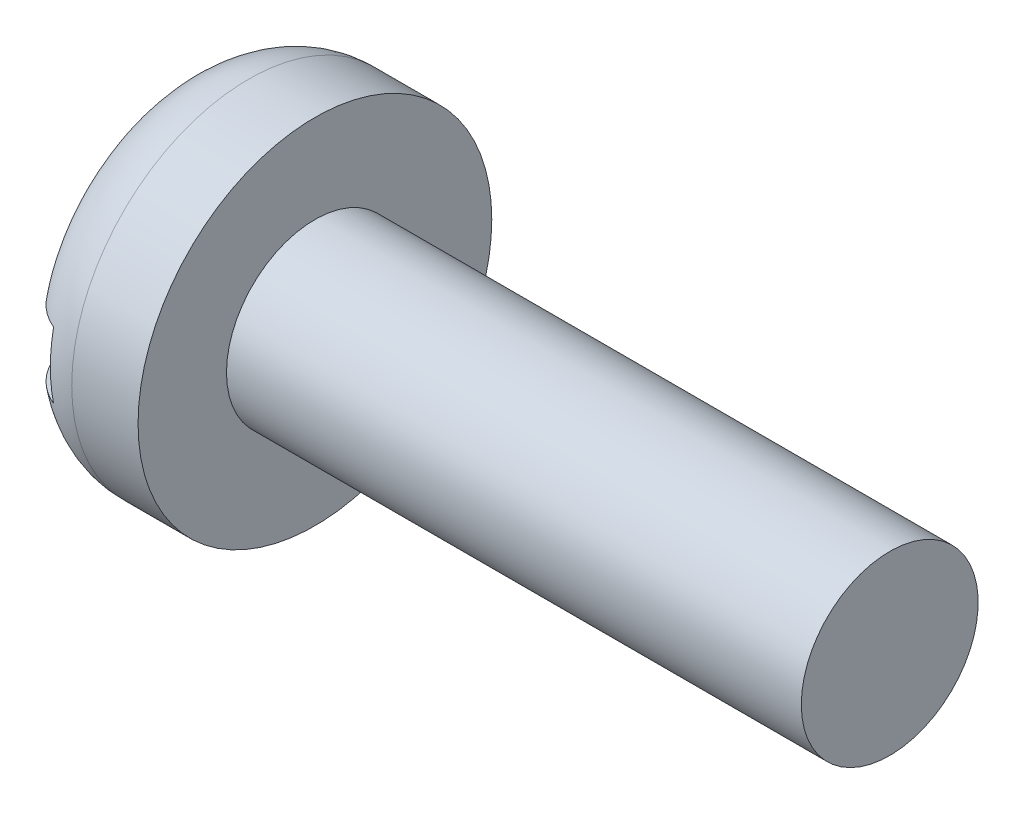
ISO-10303-21;
HEADER;
FILE_DESCRIPTION(('STEP AP214'),'2;1');
FILE_NAME('part.step','',(''),(''),'','','');
FILE_SCHEMA(('AUTOMOTIVE_DESIGN { 1 0 10303 214 1 1 1 1 }'));
ENDSEC;
DATA;
#1=APPLICATION_CONTEXT('core data for automotive mechanical design processes');
#2=APPLICATION_PROTOCOL_DEFINITION('international standard','automotive_design',2000,#1);
#3=PRODUCT_CONTEXT('',#1,'mechanical');
#4=PRODUCT('Part','Part','',(#3));
#5=PRODUCT_RELATED_PRODUCT_CATEGORY('part','',(#4));
#6=PRODUCT_DEFINITION_FORMATION('','',#4);
#7=PRODUCT_DEFINITION_CONTEXT('part definition',#1,'design');
#8=PRODUCT_DEFINITION('design','',#6,#7);
#9=PRODUCT_DEFINITION_SHAPE('','',#8);
#10=(LENGTH_UNIT() NAMED_UNIT(*) SI_UNIT(.MILLI.,.METRE.));
#11=(NAMED_UNIT(*) PLANE_ANGLE_UNIT() SI_UNIT($,.RADIAN.));
#12=(NAMED_UNIT(*) SI_UNIT($,.STERADIAN.) SOLID_ANGLE_UNIT());
#13=UNCERTAINTY_MEASURE_WITH_UNIT(LENGTH_MEASURE(1.E-05),#10,'distance_accuracy_value','');
#14=(GEOMETRIC_REPRESENTATION_CONTEXT(3) GLOBAL_UNCERTAINTY_ASSIGNED_CONTEXT((#13)) GLOBAL_UNIT_ASSIGNED_CONTEXT((#10,
#11,#12)) REPRESENTATION_CONTEXT('',''));
#15=CARTESIAN_POINT('',(0.,0.,0.));
#16=DIRECTION('',(0.,0.,1.));
#17=DIRECTION('',(1.,0.,0.));
#18=AXIS2_PLACEMENT_3D('',#15,#16,#17);
#19=CARTESIAN_POINT('',(-37.4997406619867,3.72508897386455,17.2573315857727));
#20=DIRECTION('',(-1.,0.,0.));
#21=DIRECTION('',(0.,0.,1.));
#22=AXIS2_PLACEMENT_3D('',#19,#20,#21);
#23=PLANE('',#22);
#24=DIRECTION('',(0.,0.,-1.));
#25=VECTOR('',#24,1.);
#26=CARTESIAN_POINT('',(-37.4997406619867,4.47508897386454,21.2573315857727));
#27=LINE('',#26,#25);
#28=CARTESIAN_POINT('',(-37.4997406619867,4.47508897386454,19.5371342088083));
#29=VERTEX_POINT('',#28);
#30=CARTESIAN_POINT('',(-37.4997406619867,4.47508897386454,14.9775289627371));
#31=VERTEX_POINT('',#30);
#32=EDGE_CURVE('E93',#29,#31,#27,.T.);
#33=ORIENTED_EDGE('',*,*,#32,.F.);
#34=CARTESIAN_POINT('',(-37.4997406619867,3.72508897386455,17.2573315857727));
#35=DIRECTION('',(-1.,0.,0.));
#36=DIRECTION('',(0.,0.,1.));
#37=AXIS2_PLACEMENT_3D('',#34,#35,#36);
#38=CIRCLE('',#37,2.4);
#39=EDGE_CURVE('E100',#29,#31,#38,.T.);
#40=ORIENTED_EDGE('',*,*,#39,.T.);
#41=EDGE_LOOP('',(#33,#40));
#42=FACE_BOUND('',#41,.T.);
#43=ADVANCED_FACE('F39',(#42),#23,.T.);
#44=CARTESIAN_POINT('',(-62.8997406619867,3.72508897386455,17.2573315857727));
#45=DIRECTION('',(-1.,0.,0.));
#46=DIRECTION('',(0.,0.,1.));
#47=AXIS2_PLACEMENT_3D('',#44,#45,#46);
#48=CYLINDRICAL_SURFACE('',#47,2.);
#49=CARTESIAN_POINT('',(-21.3997406619867,3.72508897386455,17.2573315857727));
#50=DIRECTION('',(-1.,0.,0.));
#51=DIRECTION('',(0.,0.,1.));
#52=AXIS2_PLACEMENT_3D('',#49,#50,#51);
#53=CIRCLE('',#52,2.);
#54=CARTESIAN_POINT('',(-21.3997406619867,3.72508897386455,19.2573315857727));
#55=VERTEX_POINT('',#54);
#56=EDGE_CURVE('E104',#55,#55,#53,.T.);
#57=ORIENTED_EDGE('',*,*,#56,.T.);
#58=EDGE_LOOP('',(#57));
#59=FACE_BOUND('',#58,.T.);
#60=CARTESIAN_POINT('',(-34.3997406619867,3.72508897386455,17.2573315857727));
#61=DIRECTION('',(-1.,0.,0.));
#62=DIRECTION('',(0.,0.,1.));
#63=AXIS2_PLACEMENT_3D('',#60,#61,#62);
#64=CIRCLE('',#63,2.);
#65=CARTESIAN_POINT('',(-34.3997406619867,3.72508897386455,19.2573315857727));
#66=VERTEX_POINT('',#65);
#67=EDGE_CURVE('E170',#66,#66,#64,.T.);
#68=ORIENTED_EDGE('',*,*,#67,.F.);
#69=EDGE_LOOP('',(#68));
#70=FACE_BOUND('',#69,.T.);
#71=ADVANCED_FACE('F41',(#59,#70),#48,.T.);
#72=CARTESIAN_POINT('',(-21.3997406619867,5.72508897386455,17.2573315857727));
#73=DIRECTION('',(1.,0.,0.));
#74=DIRECTION('',(0.,0.,-1.));
#75=AXIS2_PLACEMENT_3D('',#72,#73,#74);
#76=PLANE('',#75);
#77=ORIENTED_EDGE('',*,*,#56,.F.);
#78=EDGE_LOOP('',(#77));
#79=FACE_BOUND('',#78,.T.);
#80=ADVANCED_FACE('F156',(#79),#76,.T.);
#81=DIRECTION('',(0.,0.,1.));
#82=VECTOR('',#81,1.);
#83=CARTESIAN_POINT('',(-37.4997406619867,2.97508897386455,13.2573315857727));
#84=LINE('',#83,#82);
#85=CARTESIAN_POINT('',(-37.4997406619867,2.97508897386455,14.9775289627371));
#86=VERTEX_POINT('',#85);
#87=CARTESIAN_POINT('',(-37.4997406619867,2.97508897386455,19.5371342088083));
#88=VERTEX_POINT('',#87);
#89=EDGE_CURVE('E84',#86,#88,#84,.T.);
#90=ORIENTED_EDGE('',*,*,#89,.F.);
#91=EDGE_CURVE('E91',#86,#88,#38,.T.);
#92=ORIENTED_EDGE('',*,*,#91,.T.);
#93=EDGE_LOOP('',(#90,#92));
#94=FACE_BOUND('',#93,.T.);
#95=ADVANCED_FACE('F90',(#94),#23,.T.);
#96=CARTESIAN_POINT('',(-35.8997406619867,3.72508897386455,17.2573315857727));
#97=DIRECTION('',(-1.,0.,0.));
#98=DIRECTION('',(0.,0.,1.));
#99=AXIS2_PLACEMENT_3D('',#96,#97,#98);
#100=TOROIDAL_SURFACE('',#99,2.4,1.6);
#101=CARTESIAN_POINT('',(-36.8326937387209,4.47508897386454,13.6343000669558));
#102=CARTESIAN_POINT('',(-36.7611763459186,4.47508897386454,13.5818912847575));
#103=CARTESIAN_POINT('',(-36.685181788439,4.47508897386454,13.5353974658026));
#104=CARTESIAN_POINT('',(-36.5263426882564,4.47508897386454,13.455731033509));
#105=CARTESIAN_POINT('',(-36.4434828236553,4.47508897386454,13.422589240234));
#106=CARTESIAN_POINT('',(-36.2733987540385,4.47508897386454,13.370747746849));
#107=CARTESIAN_POINT('',(-36.1861771826822,4.47508897386454,13.3520394410867));
#108=CARTESIAN_POINT('',(-36.0098760186607,4.47508897386454,13.3296221301884));
#109=CARTESIAN_POINT('',(-35.9207974261749,4.47508897386454,13.3259052503686));
#110=CARTESIAN_POINT('',(-35.7436886665952,4.47508897386454,13.3335412500213));
#111=CARTESIAN_POINT('',(-35.6556555927101,4.47508897386454,13.3448268299957));
#112=CARTESIAN_POINT('',(-35.4827260867454,4.47508897386454,13.3820112546723));
#113=CARTESIAN_POINT('',(-35.3978299123315,4.47508897386454,13.4079112969799));
#114=CARTESIAN_POINT('',(-35.2335198039504,4.47508897386454,13.4735661587918));
#115=CARTESIAN_POINT('',(-35.1541091979547,4.47508897386454,13.5133293018027));
#116=CARTESIAN_POINT('',(-35.003021460237,4.47508897386454,13.6055192300841));
#117=CARTESIAN_POINT('',(-34.9313443870018,4.47508897386454,13.6579461111178));
#118=CARTESIAN_POINT('',(-34.7970901894026,4.47508897386454,13.7744017660039));
#119=CARTESIAN_POINT('',(-34.734593246165,4.47508897386454,13.8385229252053));
#120=CARTESIAN_POINT('',(-34.62103338648,4.47508897386454,13.9761881646689));
#121=CARTESIAN_POINT('',(-34.5699711416672,4.47508897386454,14.0497327980346));
#122=CARTESIAN_POINT('',(-34.47970658466,4.47508897386454,14.2055132059807));
#123=CARTESIAN_POINT('',(-34.4407302173441,4.47508897386454,14.2878797848903));
#124=CARTESIAN_POINT('',(-34.3766989972979,4.47508897386454,14.4578435210552));
#125=CARTESIAN_POINT('',(-34.3516453222181,4.47508897386454,14.5454411200823));
#126=CARTESIAN_POINT('',(-34.3152293189587,4.47508897386454,14.7262905955431));
#127=CARTESIAN_POINT('',(-34.3043212059704,4.47508897386454,14.8196336445367));
#128=CARTESIAN_POINT('',(-34.2974979438861,4.47508897386454,15.0068517983528));
#129=CARTESIAN_POINT('',(-34.3015860412679,4.47508897386454,15.10072701399));
#130=CARTESIAN_POINT('',(-34.324701924854,4.47508897386454,15.2917257970435));
#131=CARTESIAN_POINT('',(-34.3445208984171,4.47508897386454,15.3887527567914));
#132=CARTESIAN_POINT('',(-34.3987820821609,4.47508897386454,15.5785792833956));
#133=CARTESIAN_POINT('',(-34.4332258031543,4.47508897386454,15.6713784123979));
#134=CARTESIAN_POINT('',(-34.5188734245046,4.47508897386454,15.8593964674298));
#135=CARTESIAN_POINT('',(-34.571338417323,4.47508897386454,15.9540373854623));
#136=CARTESIAN_POINT('',(-34.6893140644574,4.47508897386454,16.1348423970902));
#137=CARTESIAN_POINT('',(-34.7548354990026,4.47508897386454,16.2209993974029));
#138=CARTESIAN_POINT('',(-34.8668389938962,4.47508897386454,16.3500157565316));
#139=CARTESIAN_POINT('',(-34.9098632557085,4.47508897386454,16.3959454604744));
#140=CARTESIAN_POINT('',(-34.9991000425274,4.47508897386454,16.4846442279708));
#141=CARTESIAN_POINT('',(-35.0453139148557,4.47508897386454,16.5274119398741));
#142=CARTESIAN_POINT('',(-35.1406465130439,4.47508897386454,16.6097122292358));
#143=CARTESIAN_POINT('',(-35.1897691666025,4.47508897386454,16.6492402522972));
#144=CARTESIAN_POINT('',(-35.2906786988012,4.47508897386454,16.7246628757944));
#145=CARTESIAN_POINT('',(-35.3424636897444,4.47508897386454,16.760559998515));
#146=CARTESIAN_POINT('',(-35.4453138669988,4.47508897386454,16.825565799669));
#147=CARTESIAN_POINT('',(-35.4961866061636,4.47508897386454,16.8549706841422));
#148=CARTESIAN_POINT('',(-35.5747897455289,4.47508897386454,16.8943915382871));
#149=CARTESIAN_POINT('',(-35.6013401762586,4.47508897386454,16.9067388259867));
#150=CARTESIAN_POINT('',(-35.6553270807767,4.47508897386454,16.9292863892151));
#151=CARTESIAN_POINT('',(-35.6827628395113,4.47508897386454,16.9394883497609));
#152=CARTESIAN_POINT('',(-35.7445073289804,4.47508897386454,16.9587627374997));
#153=CARTESIAN_POINT('',(-35.7790455876086,4.47508897386454,16.9671435543277));
#154=CARTESIAN_POINT('',(-35.8489547208982,4.47508897386454,16.9776648375502));
#155=CARTESIAN_POINT('',(-35.8843203036368,4.47508897386454,16.9798376736944));
#156=CARTESIAN_POINT('',(-35.9548215295936,4.47508897386454,16.9773431557352));
#157=CARTESIAN_POINT('',(-35.9899569167124,4.47508897386454,16.9726691695901));
#158=CARTESIAN_POINT('',(-36.0591601548943,4.47508897386454,16.9577838074772));
#159=CARTESIAN_POINT('',(-36.0932202307995,4.47508897386454,16.9475389893658));
#160=CARTESIAN_POINT('',(-36.1694644151856,4.47508897386454,16.919866542485));
#161=CARTESIAN_POINT('',(-36.2111892526799,4.47508897386454,16.9012229927515));
#162=CARTESIAN_POINT('',(-36.2927837251387,4.47508897386454,16.8601803937274));
#163=CARTESIAN_POINT('',(-36.332649215356,4.47508897386454,16.8377734228196));
#164=CARTESIAN_POINT('',(-36.410985338232,4.47508897386454,16.7902368966125));
#165=CARTESIAN_POINT('',(-36.4494479080442,4.47508897386454,16.7650941607155));
#166=CARTESIAN_POINT('',(-36.5249157634443,4.47508897386454,16.7127028317492));
#167=CARTESIAN_POINT('',(-36.5619206012309,4.47508897386454,16.6854535990827));
#168=CARTESIAN_POINT('',(-36.6566775100853,4.47508897386454,16.6118632778251));
#169=CARTESIAN_POINT('',(-36.7132833008306,4.47508897386454,16.564034511826));
#170=CARTESIAN_POINT('',(-36.8224280040267,4.47508897386454,16.4638814855673));
#171=CARTESIAN_POINT('',(-36.8749643266711,4.47508897386454,16.4115544065499));
#172=CARTESIAN_POINT('',(-36.9750402199649,4.47508897386454,16.3028103957052));
#173=CARTESIAN_POINT('',(-37.022604884669,4.47508897386454,16.2464167010322));
#174=CARTESIAN_POINT('',(-37.1122752585251,4.47508897386454,16.1294960613585));
#175=CARTESIAN_POINT('',(-37.1543838651863,4.47508897386454,16.0689713364855));
#176=CARTESIAN_POINT('',(-37.2526721380675,4.47508897386454,15.9114881287149));
#177=CARTESIAN_POINT('',(-37.304798962348,4.47508897386454,15.8119353783117));
#178=CARTESIAN_POINT('',(-37.3919510430129,4.47508897386454,15.6054496271351));
#179=CARTESIAN_POINT('',(-37.4269619950411,4.47508897386454,15.4985105382145));
#180=CARTESIAN_POINT('',(-37.4776316886803,4.47508897386454,15.2794654371773));
#181=CARTESIAN_POINT('',(-37.4931870646919,4.47508897386454,15.1673350820416));
#182=CARTESIAN_POINT('',(-37.5029412781875,4.47508897386454,14.9421584576259));
#183=CARTESIAN_POINT('',(-37.4971566789525,4.47508897386454,14.8291129666162));
#184=CARTESIAN_POINT('',(-37.4653357636207,4.47508897386454,14.6176130935778));
#185=CARTESIAN_POINT('',(-37.4414074156532,4.47508897386454,14.5188395505413));
#186=CARTESIAN_POINT('',(-37.3760895206415,4.47508897386454,14.3271675533938));
#187=CARTESIAN_POINT('',(-37.334696648568,4.47508897386454,14.2342702219157));
#188=CARTESIAN_POINT('',(-37.2388238674337,4.47508897386454,14.0635670954292));
#189=CARTESIAN_POINT('',(-37.1853936405346,4.47508897386454,13.9851690702616));
#190=CARTESIAN_POINT('',(-37.0657590887004,4.47508897386454,13.8390549104308));
#191=CARTESIAN_POINT('',(-36.999590773972,4.47508897386454,13.7713096191576));
#192=CARTESIAN_POINT('',(-36.8972658663051,4.47508897386454,13.6835483239851));
#193=CARTESIAN_POINT('',(-36.8654493963315,4.47508897386454,13.6583037960936));
#194=CARTESIAN_POINT('',(-36.8326937387209,4.47508897386454,13.6343000669558));
#195=B_SPLINE_CURVE_WITH_KNOTS('',3,(#101,#102,#103,#104,#105,#106,#107,#108,#109,#110,#111,
#112,#113,#114,#115,#116,#117,#118,#119,#120,#121,#122,#123,#124,#125,#126,#127,#128,#129,#130,
#131,#132,#133,#134,#135,#136,#137,#138,#139,#140,#141,#142,#143,#144,#145,#146,#147,#148,#149,
#150,#151,#152,#153,#154,#155,#156,#157,#158,#159,#160,#161,#162,#163,#164,#165,#166,#167,#168,
#169,#170,#171,#172,#173,#174,#175,#176,#177,#178,#179,#180,#181,#182,#183,#184,#185,#186,#187,
#188,#189,#190,#191,#192,#193,#194),.UNSPECIFIED.,.T.,.F.,(4,2,2,2,2,2,2,2,2,2,2,2,2,2,2,2,2,2,
2,2,2,2,2,2,2,2,2,2,2,2,2,2,2,2,2,2,2,2,2,2,2,2,2,2,2,2,4),(0.,0.265878834786561,
0.532367920680551,0.798697995210709,1.06488815386597,1.32988823112506,1.59491002738964,
1.86009121947644,2.12527441692328,2.39265125554473,2.66004379483927,2.93216970601052,
3.20431863143993,3.48500599011149,3.76575411740669,4.06159226008894,4.35746097183106,
4.6808540338574,5.00451522446933,5.19317551840358,5.38191599781304,5.57091741552893,
5.75978662428657,5.93575492127018,6.02353040706122,6.11123669118275,6.21743410663195,
6.32307676623689,6.42882182224448,6.53520879704629,6.67199213284779,6.80906707714507,
6.94683441356758,7.08464374592736,7.30670048945691,7.52889740809528,7.74991232733524,
7.97080938847412,8.30645113005913,8.64237290213508,8.98007191595257,9.31750887574646,
9.62080900127707,9.92416689747444,10.2074111628436,10.4898661611546,10.6116412390331),.UNSPECIFIED.);
#196=CARTESIAN_POINT('',(-36.4997406619867,4.47508897386454,13.4472068440337));
#197=VERTEX_POINT('',#196);
#198=EDGE_CURVE('E11',#31,#197,#195,.T.);
#199=ORIENTED_EDGE('',*,*,#198,.F.);
#200=ORIENTED_EDGE('',*,*,#39,.F.);
#201=CARTESIAN_POINT('',(-36.8551205048595,4.47508897386454,18.0844828163999));
#202=CARTESIAN_POINT('',(-36.8135665309969,4.47508897386454,18.0427276297639));
#203=CARTESIAN_POINT('',(-36.7706073429042,4.47508897386454,18.0023648481786));
#204=CARTESIAN_POINT('',(-36.6821325348642,4.47508897386454,17.9244773139392));
#205=CARTESIAN_POINT('',(-36.6366148888145,4.47508897386454,17.8869548674015));
#206=CARTESIAN_POINT('',(-36.5431131161184,4.47508897386454,17.8149191233318));
#207=CARTESIAN_POINT('',(-36.4951243308773,4.47508897386454,17.78041186671));
#208=CARTESIAN_POINT('',(-36.3967270992574,4.47508897386454,17.7150980208682));
#209=CARTESIAN_POINT('',(-36.3463214811756,4.47508897386454,17.6842872469683));
#210=CARTESIAN_POINT('',(-36.2527379145821,4.47508897386454,17.6335453308927));
#211=CARTESIAN_POINT('',(-36.2100814377626,4.47508897386454,17.6126655718355));
#212=CARTESIAN_POINT('',(-36.1225082526633,4.47508897386454,17.5766100542691));
#213=CARTESIAN_POINT('',(-36.0776048363795,4.47508897386454,17.5614044197171));
#214=CARTESIAN_POINT('',(-35.9983506008281,4.47508897386454,17.5434707313786));
#215=CARTESIAN_POINT('',(-35.9645539659998,4.47508897386454,17.5384442207976));
#216=CARTESIAN_POINT('',(-35.896660117952,4.47508897386454,17.5347043874139));
#217=CARTESIAN_POINT('',(-35.8625637794442,4.47508897386454,17.5359765075105));
#218=CARTESIAN_POINT('',(-35.7863731890368,4.47508897386454,17.5455288865674));
#219=CARTESIAN_POINT('',(-35.7445134213994,4.47508897386454,17.555551134451));
#220=CARTESIAN_POINT('',(-35.6626331975134,4.47508897386454,17.5818778850866));
#221=CARTESIAN_POINT('',(-35.6226304994838,4.47508897386454,17.5982328919375));
#222=CARTESIAN_POINT('',(-35.5296513150643,4.47508897386454,17.6416264981745));
#223=CARTESIAN_POINT('',(-35.4774907184163,4.47508897386454,17.6703662136599));
#224=CARTESIAN_POINT('',(-35.3757748640344,4.47508897386454,17.7322023010506));
#225=CARTESIAN_POINT('',(-35.3262246448018,4.47508897386454,17.7653066953002));
#226=CARTESIAN_POINT('',(-35.2294728724209,4.47508897386454,17.8349257726654));
#227=CARTESIAN_POINT('',(-35.1822747682207,4.47508897386454,17.8714452501923));
#228=CARTESIAN_POINT('',(-35.0904236306598,4.47508897386454,17.9474495426824));
#229=CARTESIAN_POINT('',(-35.0457683624196,4.47508897386454,17.986931680761));
#230=CARTESIAN_POINT('',(-34.9118222875266,4.47508897386454,18.1135357614168));
#231=CARTESIAN_POINT('',(-34.8270595042737,4.47508897386454,18.2055845804415));
#232=CARTESIAN_POINT('',(-34.6730473658621,4.47508897386454,18.4014501500052));
#233=CARTESIAN_POINT('',(-34.6037448570802,4.47508897386454,18.5052246725548));
#234=CARTESIAN_POINT('',(-34.4912697013202,4.47508897386454,18.7102973364324));
#235=CARTESIAN_POINT('',(-34.4459684240571,4.47508897386454,18.8104193016935));
#236=CARTESIAN_POINT('',(-34.372532367326,4.47508897386454,19.0169558960277));
#237=CARTESIAN_POINT('',(-34.344412894812,4.47508897386454,19.1233760437436));
#238=CARTESIAN_POINT('',(-34.3073195643274,4.47508897386454,19.3400717285187));
#239=CARTESIAN_POINT('',(-34.2984351098277,4.47508897386454,19.4503628578474));
#240=CARTESIAN_POINT('',(-34.3013548310125,4.47508897386454,19.6706672015938));
#241=CARTESIAN_POINT('',(-34.3131453453362,4.47508897386454,19.7806805514614));
#242=CARTESIAN_POINT('',(-34.3556187691875,4.47508897386454,19.986339492347));
#243=CARTESIAN_POINT('',(-34.384444420265,4.47508897386454,20.0823702731811));
#244=CARTESIAN_POINT('',(-34.4588468028388,4.47508897386454,20.2677170204791));
#245=CARTESIAN_POINT('',(-34.5044179491934,4.47508897386454,20.3570352138486));
#246=CARTESIAN_POINT('',(-34.6078423823074,4.47508897386454,20.5207090618881));
#247=CARTESIAN_POINT('',(-34.6647801551404,4.47508897386454,20.595644330634));
#248=CARTESIAN_POINT('',(-34.7908120513963,4.47508897386454,20.7344786420743));
#249=CARTESIAN_POINT('',(-34.8599032874951,4.47508897386454,20.798380298918));
#250=CARTESIAN_POINT('',(-35.0058112833543,4.47508897386454,20.9112042614173));
#251=CARTESIAN_POINT('',(-35.0823043782943,4.47508897386454,20.9605455520765));
#252=CARTESIAN_POINT('',(-35.2426013765225,4.47508897386454,21.0454240704246));
#253=CARTESIAN_POINT('',(-35.3264045383439,4.47508897386454,21.0809626961414));
#254=CARTESIAN_POINT('',(-35.4973824841709,4.47508897386454,21.1366369699118));
#255=CARTESIAN_POINT('',(-35.5844745712838,4.47508897386454,21.1570268373764));
#256=CARTESIAN_POINT('',(-35.7608521000623,4.47508897386454,21.1827743562619));
#257=CARTESIAN_POINT('',(-35.8501374201334,4.47508897386454,21.1881328391461));
#258=CARTESIAN_POINT('',(-36.0276608983512,4.47508897386454,21.1836714034306));
#259=CARTESIAN_POINT('',(-36.1159019082791,4.47508897386454,21.1739639453449));
#260=CARTESIAN_POINT('',(-36.2894997727852,4.47508897386454,21.1398738344592));
#261=CARTESIAN_POINT('',(-36.3748566681647,4.47508897386454,21.1154913893572));
#262=CARTESIAN_POINT('',(-36.5403028544011,4.47508897386454,21.0527775083913));
#263=CARTESIAN_POINT('',(-36.6203908368286,4.47508897386454,21.0144426230408));
#264=CARTESIAN_POINT('',(-36.7730589876276,4.47508897386454,20.9249704351588));
#265=CARTESIAN_POINT('',(-36.8456390150561,4.47508897386454,20.8738328923512));
#266=CARTESIAN_POINT('',(-36.9818711300342,4.47508897386454,20.7598161034952));
#267=CARTESIAN_POINT('',(-37.0454487957245,4.47508897386454,20.6968479830421));
#268=CARTESIAN_POINT('',(-37.1613378871347,4.47508897386454,20.5612899360383));
#269=CARTESIAN_POINT('',(-37.2136487572695,4.47508897386454,20.4886995352812));
#270=CARTESIAN_POINT('',(-37.3065323472,4.47508897386454,20.334665611497));
#271=CARTESIAN_POINT('',(-37.346888955086,4.47508897386454,20.2530918822956));
#272=CARTESIAN_POINT('',(-37.4137798561746,4.47508897386454,20.0844715411337));
#273=CARTESIAN_POINT('',(-37.4403125181951,4.47508897386454,19.9974242846718));
#274=CARTESIAN_POINT('',(-37.4797640517529,4.47508897386454,19.817517308818));
#275=CARTESIAN_POINT('',(-37.492242414052,4.47508897386454,19.7245612651415));
#276=CARTESIAN_POINT('',(-37.5022234013967,4.47508897386454,19.5378762756786));
#277=CARTESIAN_POINT('',(-37.4997250689445,4.47508897386454,19.444147280858));
#278=CARTESIAN_POINT('',(-37.4798584530996,4.47508897386454,19.2533630175794));
#279=CARTESIAN_POINT('',(-37.4617232266646,4.47508897386454,19.1563884288476));
#280=CARTESIAN_POINT('',(-37.4107683407586,4.47508897386454,18.9663669603473));
#281=CARTESIAN_POINT('',(-37.3779393301913,4.47508897386454,18.8733226231141));
#282=CARTESIAN_POINT('',(-37.2956376693478,4.47508897386454,18.6847730795411));
#283=CARTESIAN_POINT('',(-37.2449226767127,4.47508897386454,18.5898139300291));
#284=CARTESIAN_POINT('',(-37.1304093354619,4.47508897386454,18.4083238843995));
#285=CARTESIAN_POINT('',(-37.0666239408555,4.47508897386454,18.3217847675203));
#286=CARTESIAN_POINT('',(-36.9749165148756,4.47508897386454,18.2129618232972));
#287=CARTESIAN_POINT('',(-36.9517014221039,4.47508897386454,18.1865808936142));
#288=CARTESIAN_POINT('',(-36.904197775595,4.47508897386454,18.1347957160754));
#289=CARTESIAN_POINT('',(-36.8799091711601,4.47508897386454,18.1093915144527));
#290=CARTESIAN_POINT('',(-36.8551205048595,4.47508897386454,18.0844828163999));
#291=B_SPLINE_CURVE_WITH_KNOTS('',3,(#201,#202,#203,#204,#205,#206,#207,#208,#209,#210,#211,
#212,#213,#214,#215,#216,#217,#218,#219,#220,#221,#222,#223,#224,#225,#226,#227,#228,#229,#230,
#231,#232,#233,#234,#235,#236,#237,#238,#239,#240,#241,#242,#243,#244,#245,#246,#247,#248,#249,
#250,#251,#252,#253,#254,#255,#256,#257,#258,#259,#260,#261,#262,#263,#264,#265,#266,#267,#268,
#269,#270,#271,#272,#273,#274,#275,#276,#277,#278,#279,#280,#281,#282,#283,#284,#285,#286,#287,
#288,#289,#290),.UNSPECIFIED.,.T.,.F.,(4,2,2,2,2,2,2,2,2,2,2,2,2,2,2,2,2,2,2,2,2,2,2,2,2,2,2,2,
2,2,2,2,2,2,2,2,2,2,2,2,2,2,2,2,4),(0.,0.176703968272002,0.353549900014256,0.530742384330755,
0.707732342576595,0.850008092413657,0.991523776207308,1.09352701733519,1.19529462353228,
1.32361591970809,1.45298239324122,1.63128111185863,1.8099122377302,1.98879801920258,
2.16752407244385,2.5414873182849,2.91414432519957,3.24243311188485,3.5710139402125,
3.90111874726956,4.23100551376951,4.53023957280142,4.82937391845412,5.11031586677612,
5.39119116104475,5.66294702986159,5.93467536620991,6.20173377025974,6.46877740164191,
6.73383723832379,6.9988933236485,7.26401498382593,7.52914162009506,7.79634594405551,
8.06356344130892,8.33535220112159,8.6071730238964,8.88729520617517,9.16743529756538,
9.4621515147605,9.75705555606143,10.0787855884891,10.4001982849098,10.5056045366461,
10.6110157716331),.UNSPECIFIED.);
#292=CARTESIAN_POINT('',(-36.4997406619867,4.47508897386454,21.0674563275117));
#293=VERTEX_POINT('',#292);
#294=EDGE_CURVE('E119',#293,#29,#291,.T.);
#295=ORIENTED_EDGE('',*,*,#294,.F.);
#296=CARTESIAN_POINT('',(-36.4997406619867,3.72508897386455,17.2573315857727));
#297=DIRECTION('',(-1.,0.,0.));
#298=DIRECTION('',(0.,0.,1.));
#299=AXIS2_PLACEMENT_3D('',#296,#297,#298);
#300=CIRCLE('',#299,3.88323969741913);
#301=CARTESIAN_POINT('',(-36.4997406619867,2.97508897386455,21.0674563275117));
#302=VERTEX_POINT('',#301);
#303=EDGE_CURVE('E112',#293,#302,#300,.F.);
#304=ORIENTED_EDGE('',*,*,#303,.T.);
#305=CARTESIAN_POINT('',(-36.8551205048595,2.97508897386455,18.0844828163999));
#306=CARTESIAN_POINT('',(-36.9383920258895,2.97508897386455,18.1681556750936));
#307=CARTESIAN_POINT('',(-37.016114593583,2.97508897386455,18.257504090064));
#308=CARTESIAN_POINT('',(-37.1574422589112,2.97508897386455,18.4470526934647));
#309=CARTESIAN_POINT('',(-37.2210251613824,2.97508897386455,18.5472695805329));
#310=CARTESIAN_POINT('',(-37.3262146213812,2.97508897386455,18.7485881611009));
#311=CARTESIAN_POINT('',(-37.3691724955303,2.97508897386455,18.8489774818655));
#312=CARTESIAN_POINT('',(-37.4378057221774,2.97508897386455,19.0554918791423));
#313=CARTESIAN_POINT('',(-37.463494003955,2.97508897386455,19.1616126002567));
#314=CARTESIAN_POINT('',(-37.4958457390477,2.97508897386455,19.3773181012488));
#315=CARTESIAN_POINT('',(-37.5024132377242,2.97508897386455,19.4869175718561));
#316=CARTESIAN_POINT('',(-37.4950950383772,2.97508897386455,19.7054833355565));
#317=CARTESIAN_POINT('',(-37.4812119720271,2.97508897386455,19.814449708308));
#318=CARTESIAN_POINT('',(-37.4349987215307,2.97508897386455,20.0180281945857));
#319=CARTESIAN_POINT('',(-37.4044522415924,2.97508897386455,20.1130467698232));
#320=CARTESIAN_POINT('',(-37.326859302371,2.97508897386455,20.296083688352));
#321=CARTESIAN_POINT('',(-37.2798203871034,2.97508897386455,20.3841052097106));
#322=CARTESIAN_POINT('',(-37.1737264641733,2.97508897386455,20.5452402854393));
#323=CARTESIAN_POINT('',(-37.1155379915249,2.97508897386455,20.6189254099195));
#324=CARTESIAN_POINT('',(-36.987251582862,2.97508897386455,20.7550775272879));
#325=CARTESIAN_POINT('',(-36.9171559909924,2.97508897386455,20.8175467232773));
#326=CARTESIAN_POINT('',(-36.769468724427,2.97508897386455,20.9274794012556));
#327=CARTESIAN_POINT('',(-36.6921818634535,2.97508897386455,20.9753527734193));
#328=CARTESIAN_POINT('',(-36.5305644269357,2.97508897386455,21.0571904956486));
#329=CARTESIAN_POINT('',(-36.4462345879948,2.97508897386455,21.0911562980764));
#330=CARTESIAN_POINT('',(-36.2744372094295,2.97508897386455,21.1436753928018));
#331=CARTESIAN_POINT('',(-36.1870448080557,2.97508897386455,21.1624747266003));
#332=CARTESIAN_POINT('',(-36.0103404097771,2.97508897386455,21.1850203759749));
#333=CARTESIAN_POINT('',(-35.9210285126439,2.97508897386455,21.1887674720433));
#334=CARTESIAN_POINT('',(-35.7436839957515,2.97508897386455,21.1811221296257));
#335=CARTESIAN_POINT('',(-35.6556467976158,2.97508897386455,21.1698353411886));
#336=CARTESIAN_POINT('',(-35.4827170793621,2.97508897386455,21.1326490890829));
#337=CARTESIAN_POINT('',(-35.3978245208438,2.97508897386455,21.1067498039151));
#338=CARTESIAN_POINT('',(-35.2335183440886,2.97508897386455,21.0410963456932));
#339=CARTESIAN_POINT('',(-35.1541082552509,2.97508897386455,21.0013333455429));
#340=CARTESIAN_POINT('',(-35.003020570667,2.97508897386455,20.9091433476551));
#341=CARTESIAN_POINT('',(-34.931343121209,2.97508897386455,20.8567161103929));
#342=CARTESIAN_POINT('',(-34.797088717611,2.97508897386455,20.7402599797062));
#343=CARTESIAN_POINT('',(-34.734591885644,2.97508897386455,20.6761387691844));
#344=CARTESIAN_POINT('',(-34.621032189903,2.97508897386455,20.5384733840946));
#345=CARTESIAN_POINT('',(-34.569970008917,2.97508897386455,20.4649286472391));
#346=CARTESIAN_POINT('',(-34.4797055954309,2.97508897386455,20.3091480256628));
#347=CARTESIAN_POINT('',(-34.4407293105037,2.97508897386455,20.2267813354435));
#348=CARTESIAN_POINT('',(-34.376698319487,2.97508897386455,20.0568174952768));
#349=CARTESIAN_POINT('',(-34.3516447737835,2.97508897386455,19.9692199100357));
#350=CARTESIAN_POINT('',(-34.3152290086665,2.97508897386455,19.7883704346867));
#351=CARTESIAN_POINT('',(-34.3043210121812,2.97508897386455,19.695027371056));
#352=CARTESIAN_POINT('',(-34.2974979792353,2.97508897386455,19.5078091795339));
#353=CARTESIAN_POINT('',(-34.3015861935757,2.97508897386455,19.4139339406844));
#354=CARTESIAN_POINT('',(-34.3247023133623,2.97508897386455,19.2229351739486));
#355=CARTESIAN_POINT('',(-34.3445213989053,2.97508897386455,19.1259082538447));
#356=CARTESIAN_POINT('',(-34.3987828137216,2.97508897386455,18.936081739225));
#357=CARTESIAN_POINT('',(-34.4332266662325,2.97508897386455,18.8432825861659));
#358=CARTESIAN_POINT('',(-34.5188746256111,2.97508897386455,18.6552643715226));
#359=CARTESIAN_POINT('',(-34.571339845733,2.97508897386455,18.5606233292185));
#360=CARTESIAN_POINT('',(-34.6893157916753,2.97508897386455,18.3798183956116));
#361=CARTESIAN_POINT('',(-34.7548372572164,2.97508897386455,18.2936615709594));
#362=CARTESIAN_POINT('',(-34.86684067772,2.97508897386455,18.1646455792879));
#363=CARTESIAN_POINT('',(-34.9098648403238,2.97508897386455,18.1187160662048));
#364=CARTESIAN_POINT('',(-34.9991014039717,2.97508897386455,18.0300176601726));
#365=CARTESIAN_POINT('',(-35.0453151523502,2.97508897386455,17.987250118889));
#366=CARTESIAN_POINT('',(-35.1406478689908,2.97508897386455,17.9049498163544));
#367=CARTESIAN_POINT('',(-35.1897707880114,2.97508897386455,17.8654216362439));
#368=CARTESIAN_POINT('',(-35.2906808761584,2.97508897386455,17.7899987396204));
#369=CARTESIAN_POINT('',(-35.3424661575559,2.97508897386455,17.7541015007752));
#370=CARTESIAN_POINT('',(-35.4453167276019,2.97508897386455,17.6890956702296));
#371=CARTESIAN_POINT('',(-35.4961895563121,2.97508897386455,17.6596908519724));
#372=CARTESIAN_POINT('',(-35.5747925661617,2.97508897386455,17.620270295049));
#373=CARTESIAN_POINT('',(-35.6013427614312,2.97508897386455,17.6079231929355));
#374=CARTESIAN_POINT('',(-35.6553291785517,2.97508897386455,17.5853759794911));
#375=CARTESIAN_POINT('',(-35.6827646853414,2.97508897386455,17.5751741831123));
#376=CARTESIAN_POINT('',(-35.7445093247521,2.97508897386455,17.5558998863724));
#377=CARTESIAN_POINT('',(-35.7790480122462,2.97508897386455,17.547519080234));
#378=CARTESIAN_POINT('',(-35.8489571182532,2.97508897386455,17.536998141794));
#379=CARTESIAN_POINT('',(-35.8843222194833,2.97508897386455,17.5348254835319));
#380=CARTESIAN_POINT('',(-35.9548175670957,2.97508897386455,17.5373199582584));
#381=CARTESIAN_POINT('',(-35.9899475940679,2.97508897386455,17.5419927725125));
#382=CARTESIAN_POINT('',(-36.0591510512343,2.97508897386455,17.556876615401));
#383=CARTESIAN_POINT('',(-36.093216319572,2.97508897386455,17.5671227542226));
#384=CARTESIAN_POINT('',(-36.1695235324583,2.97508897386455,17.594818096634));
#385=CARTESIAN_POINT('',(-36.2113032665409,2.97508897386455,17.6134909625234));
#386=CARTESIAN_POINT('',(-36.2930052117435,2.97508897386455,17.6546007492596));
#387=CARTESIAN_POINT('',(-36.3329231659108,2.97508897386455,17.6770458032503));
#388=CARTESIAN_POINT('',(-36.4112524914487,2.97508897386455,17.7245986446744));
#389=CARTESIAN_POINT('',(-36.449660187987,2.97508897386455,17.749712435428));
#390=CARTESIAN_POINT('',(-36.5250219635438,2.97508897386455,17.8020380124602));
#391=CARTESIAN_POINT('',(-36.5619756744092,2.97508897386455,17.8292503249929));
#392=CARTESIAN_POINT('',(-36.643425898354,2.97508897386455,17.8925109167558));
#393=CARTESIAN_POINT('',(-36.6875216926889,2.97508897386455,17.9290774835687));
#394=CARTESIAN_POINT('',(-36.7732147646093,2.97508897386455,18.004817933372));
#395=CARTESIAN_POINT('',(-36.8148175574229,2.97508897386455,18.0439856237932));
#396=CARTESIAN_POINT('',(-36.8551205048595,2.97508897386455,18.0844828163999));
#397=B_SPLINE_CURVE_WITH_KNOTS('',3,(#305,#306,#307,#308,#309,#310,#311,#312,#313,#314,#315,
#316,#317,#318,#319,#320,#321,#322,#323,#324,#325,#326,#327,#328,#329,#330,#331,#332,#333,#334,
#335,#336,#337,#338,#339,#340,#341,#342,#343,#344,#345,#346,#347,#348,#349,#350,#351,#352,#353,
#354,#355,#356,#357,#358,#359,#360,#361,#362,#363,#364,#365,#366,#367,#368,#369,#370,#371,#372,
#373,#374,#375,#376,#377,#378,#379,#380,#381,#382,#383,#384,#385,#386,#387,#388,#389,#390,#391,
#392,#393,#394,#395,#396),.UNSPECIFIED.,.T.,.F.,(4,2,2,2,2,2,2,2,2,2,2,2,2,2,2,2,2,2,2,2,2,2,2,
2,2,2,2,2,2,2,2,2,2,2,2,2,2,2,2,2,2,2,2,2,2,4),(0.,0.35399836445325,0.708548541468174,
1.03473051058774,1.36066800326712,1.68823836620552,2.0157665795543,2.31364514113335,
2.61138762365579,2.89166775281402,3.17189276726361,3.44331105665797,3.71470099470849,
3.9815943429287,4.2484738519513,4.51348773547909,4.77849838176788,5.04367807071838,
5.308862775531,5.57623949688243,5.84363217963012,6.11575828440612,6.38790706604415,
6.66859442816705,6.94934263983984,7.2451807349977,7.54104965063415,7.86444336294826,
8.1881041966894,8.37676387083757,8.56550373158893,8.75450606258496,8.94337618298581,
9.11934460751856,9.20711921820376,9.29482462594583,9.4010232602615,9.50666446534106,
9.61239339494714,9.71879623023754,9.85576466319679,9.99303229155514,10.1306155157361,
10.2682333550685,10.4399616885494,10.6112949042605),.UNSPECIFIED.);
#398=EDGE_CURVE('E99',#88,#302,#397,.T.);
#399=ORIENTED_EDGE('',*,*,#398,.F.);
#400=ORIENTED_EDGE('',*,*,#91,.F.);
#401=CARTESIAN_POINT('',(-36.8326937387209,2.97508897386455,13.6343000669558));
#402=CARTESIAN_POINT('',(-36.906152888477,2.97508897386455,13.6881412426578));
#403=CARTESIAN_POINT('',(-36.974970851517,2.97508897386455,13.7482918716233));
#404=CARTESIAN_POINT('',(-37.1014247292257,2.97508897386455,13.8793496163167));
#405=CARTESIAN_POINT('',(-37.1590630032805,2.97508897386455,13.9502544568113));
#406=CARTESIAN_POINT('',(-37.2616279097992,2.97508897386455,14.1006185399708));
#407=CARTESIAN_POINT('',(-37.3065660718462,2.97508897386455,14.1800699327187));
#408=CARTESIAN_POINT('',(-37.382774902449,2.97508897386455,14.3452670150905));
#409=CARTESIAN_POINT('',(-37.414044541463,2.97508897386455,14.4310131782818));
#410=CARTESIAN_POINT('',(-37.462879514393,2.97508897386455,14.6082725996719));
#411=CARTESIAN_POINT('',(-37.4801398658099,2.97508897386455,14.6998696388229));
#412=CARTESIAN_POINT('',(-37.4997778568732,2.97508897386455,14.8846261073337));
#413=CARTESIAN_POINT('',(-37.5021537253686,2.97508897386455,14.9777857213067));
#414=CARTESIAN_POINT('',(-37.4922307808741,2.97508897386455,15.1677822654095));
#415=CARTESIAN_POINT('',(-37.4792234506803,2.97508897386455,15.2645815402485));
#416=CARTESIAN_POINT('',(-37.4383876243153,2.97508897386455,15.4549761966428));
#417=CARTESIAN_POINT('',(-37.4105549046216,2.97508897386455,15.5485706571057));
#418=CARTESIAN_POINT('',(-37.3386704727264,2.97508897386455,15.7381816717757));
#419=CARTESIAN_POINT('',(-37.2934699357769,2.97508897386455,15.8337608037666));
#420=CARTESIAN_POINT('',(-37.1896392212492,2.97508897386455,16.0172420120864));
#421=CARTESIAN_POINT('',(-37.1310055937852,2.97508897386455,16.1051421082613));
#422=CARTESIAN_POINT('',(-36.9932485095648,2.97508897386455,16.2846151228978));
#423=CARTESIAN_POINT('',(-36.9123835169015,2.97508897386455,16.3748515392365));
#424=CARTESIAN_POINT('',(-36.7825266612207,2.97508897386455,16.5013340564388));
#425=CARTESIAN_POINT('',(-36.7377620662853,2.97508897386455,16.5420549548888));
#426=CARTESIAN_POINT('',(-36.6456343905287,2.97508897386455,16.6204408539751));
#427=CARTESIAN_POINT('',(-36.5982722588804,2.97508897386455,16.658106958564));
#428=CARTESIAN_POINT('',(-36.5195252074192,2.97508897386455,16.7163963300519));
#429=CARTESIAN_POINT('',(-36.4889039649895,2.97508897386455,16.7380592467205));
#430=CARTESIAN_POINT('',(-36.4266714574388,2.97508897386455,16.7799088603087));
#431=CARTESIAN_POINT('',(-36.3950603985479,2.97508897386455,16.8000958618531));
#432=CARTESIAN_POINT('',(-36.3307557972162,2.97508897386455,16.8386643306985));
#433=CARTESIAN_POINT('',(-36.2980624997025,2.97508897386455,16.8570462028428));
#434=CARTESIAN_POINT('',(-36.2314327867978,2.97508897386455,16.8913660236307));
#435=CARTESIAN_POINT('',(-36.1974975166662,2.97508897386455,16.9073061568638));
#436=CARTESIAN_POINT('',(-36.1275186036686,2.97508897386455,16.9358475319983));
#437=CARTESIAN_POINT('',(-36.0914489091555,2.97508897386455,16.9483873384988));
#438=CARTESIAN_POINT('',(-36.0179521158036,2.97508897386455,16.9676403788645));
#439=CARTESIAN_POINT('',(-35.9805369924219,2.97508897386455,16.974395909857));
#440=CARTESIAN_POINT('',(-35.9045829898315,2.97508897386455,16.9802055750806));
#441=CARTESIAN_POINT('',(-35.866035940252,2.97508897386455,16.9791636204489));
#442=CARTESIAN_POINT('',(-35.7897677944459,2.97508897386455,16.9695162827799));
#443=CARTESIAN_POINT('',(-35.7520530532671,2.97508897386455,16.9608654885242));
#444=CARTESIAN_POINT('',(-35.6788204321166,2.97508897386455,16.938479489128));
#445=CARTESIAN_POINT('',(-35.6432802923451,2.97508897386455,16.9248121687168));
#446=CARTESIAN_POINT('',(-35.5736308865981,2.97508897386455,16.894161743258));
#447=CARTESIAN_POINT('',(-35.5395242159701,2.97508897386455,16.877172914275));
#448=CARTESIAN_POINT('',(-35.4723454791819,2.97508897386455,16.8408083925062));
#449=CARTESIAN_POINT('',(-35.4392814009185,2.97508897386455,16.8214181647789));
#450=CARTESIAN_POINT('',(-35.3742429675546,2.97508897386455,16.7808801643574));
#451=CARTESIAN_POINT('',(-35.3422690229607,2.97508897386455,16.7597317396732));
#452=CARTESIAN_POINT('',(-35.2492935023342,2.97508897386455,16.6951019427256));
#453=CARTESIAN_POINT('',(-35.18970905847,2.97508897386455,16.6495678077862));
#454=CARTESIAN_POINT('',(-35.0744238321501,2.97508897386455,16.5537617908317));
#455=CARTESIAN_POINT('',(-35.0187262177676,2.97508897386455,16.5034861207881));
#456=CARTESIAN_POINT('',(-34.9120523332068,2.97508897386455,16.3986616132563));
#457=CARTESIAN_POINT('',(-34.8610528895239,2.97508897386455,16.3441365046816));
#458=CARTESIAN_POINT('',(-34.7641984046148,2.97508897386455,16.2307583614419));
#459=CARTESIAN_POINT('',(-34.7183402085557,2.97508897386455,16.1719080179954));
#460=CARTESIAN_POINT('',(-34.6091793597931,2.97508897386455,16.0168436428527));
#461=CARTESIAN_POINT('',(-34.5499342914129,2.97508897386455,15.917700217241));
#462=CARTESIAN_POINT('',(-34.4485526655997,2.97508897386455,15.7108858907727));
#463=CARTESIAN_POINT('',(-34.4064249200189,2.97508897386455,15.6032106317969));
#464=CARTESIAN_POINT('',(-34.341835741135,2.97508897386455,15.3813129878988));
#465=CARTESIAN_POINT('',(-34.3194949945112,2.97508897386455,15.2670548915558));
#466=CARTESIAN_POINT('',(-34.2970038240427,2.97508897386455,15.0363539599445));
#467=CARTESIAN_POINT('',(-34.2968396998471,2.97508897386455,14.9199125179857));
#468=CARTESIAN_POINT('',(-34.3183743047989,2.97508897386455,14.7023674766785));
#469=CARTESIAN_POINT('',(-34.3376055753999,2.97508897386455,14.6010170651919));
#470=CARTESIAN_POINT('',(-34.3941902679389,2.97508897386455,14.4035042040637));
#471=CARTESIAN_POINT('',(-34.4315348488891,2.97508897386455,14.307339248853));
#472=CARTESIAN_POINT('',(-34.5200306141818,2.97508897386455,14.1304585119562));
#473=CARTESIAN_POINT('',(-34.5699522440449,2.97508897386455,14.0491258818136));
#474=CARTESIAN_POINT('',(-34.6832568418284,2.97508897386455,13.8964493257773));
#475=CARTESIAN_POINT('',(-34.7466361680835,2.97508897386455,13.825102706308));
#476=CARTESIAN_POINT('',(-34.8823332684658,2.97508897386455,13.6972831742025));
#477=CARTESIAN_POINT('',(-34.9542096456435,2.97508897386455,13.6403411285496));
#478=CARTESIAN_POINT('',(-35.1066695621284,2.97508897386455,13.5396354293069));
#479=CARTESIAN_POINT('',(-35.1872520504113,2.97508897386455,13.4958701873892));
#480=CARTESIAN_POINT('',(-35.3530244915276,2.97508897386455,13.4236600022198));
#481=CARTESIAN_POINT('',(-35.4380847148723,2.97508897386455,13.3949169774256));
#482=CARTESIAN_POINT('',(-35.6118433301085,2.97508897386455,13.3522796366964));
#483=CARTESIAN_POINT('',(-35.7005413017675,2.97508897386455,13.3383836106261));
#484=CARTESIAN_POINT('',(-35.8781185203458,2.97508897386455,13.3259286538982));
#485=CARTESIAN_POINT('',(-35.9669871721012,2.97508897386455,13.3272184163319));
#486=CARTESIAN_POINT('',(-36.143254810394,2.97508897386455,13.3447267071549));
#487=CARTESIAN_POINT('',(-36.2306534521552,2.97508897386455,13.3609486893703));
#488=CARTESIAN_POINT('',(-36.4088138042963,2.97508897386455,13.4098578673739));
#489=CARTESIAN_POINT('',(-36.4992240626289,2.97508897386455,13.4438343567784));
#490=CARTESIAN_POINT('',(-36.6723796818234,2.97508897386455,13.5276277503861));
#491=CARTESIAN_POINT('',(-36.7551242616263,2.97508897386455,13.5774462664526));
#492=CARTESIAN_POINT('',(-36.8326937387209,2.97508897386455,13.6343000669558));
#493=B_SPLINE_CURVE_WITH_KNOTS('',3,(#401,#402,#403,#404,#405,#406,#407,#408,#409,#410,#411,
#412,#413,#414,#415,#416,#417,#418,#419,#420,#421,#422,#423,#424,#425,#426,#427,#428,#429,#430,
#431,#432,#433,#434,#435,#436,#437,#438,#439,#440,#441,#442,#443,#444,#445,#446,#447,#448,#449,
#450,#451,#452,#453,#454,#455,#456,#457,#458,#459,#460,#461,#462,#463,#464,#465,#466,#467,#468,
#469,#470,#471,#472,#473,#474,#475,#476,#477,#478,#479,#480,#481,#482,#483,#484,#485,#486,#487,
#488,#489,#490,#491,#492),.UNSPECIFIED.,.T.,.F.,(4,2,2,2,2,2,2,2,2,2,2,2,2,2,2,2,2,2,2,2,2,2,2,
2,2,2,2,2,2,2,2,2,2,2,2,2,2,2,2,2,2,2,2,2,2,4),(0.,0.272882428663906,0.545707204811019,
0.818283500071823,1.0908803228147,1.36926340539986,1.64767961302728,1.93943473595276,
2.23127301985314,2.54719283984051,2.863193885476,3.22531751450638,3.40676744330658,
3.58815150413403,3.70064655369429,3.81311831866373,3.92556480127924,4.0379100845069,
4.1521671928816,4.26558148897331,4.38039567674796,4.49589978602075,4.60989526344639,
4.72408894822444,4.83901109770994,4.95397605537577,5.17865170397359,5.40350839225036,
5.62718884285217,5.85073127594835,6.19571720042878,6.54088049640746,6.88813482752474,
7.23517462967277,7.54301401067099,7.85070328826137,8.13556999392859,8.4203597124118,
8.6941166243105,8.96784052441149,9.23590433060846,9.50393725683735,9.76930185747575,
10.0347278524387,10.3228497978486,10.6110010679086),.UNSPECIFIED.);
#494=CARTESIAN_POINT('',(-36.4997406619867,2.97508897386455,13.4472068440337));
#495=VERTEX_POINT('',#494);
#496=EDGE_CURVE('E52',#495,#86,#493,.T.);
#497=ORIENTED_EDGE('',*,*,#496,.F.);
#498=EDGE_CURVE('E64',#495,#197,#300,.F.);
#499=ORIENTED_EDGE('',*,*,#498,.T.);
#500=EDGE_LOOP('',(#199,#200,#295,#304,#399,#400,#497,#499));
#501=FACE_BOUND('',#500,.T.);
#502=CARTESIAN_POINT('',(-35.8997406619867,3.72508897386455,17.2573315857727));
#503=DIRECTION('',(-1.,0.,0.));
#504=DIRECTION('',(0.,0.,1.));
#505=AXIS2_PLACEMENT_3D('',#502,#503,#504);
#506=CIRCLE('',#505,4.);
#507=CARTESIAN_POINT('',(-35.8997406619867,3.72508897386455,21.2573315857727));
#508=VERTEX_POINT('',#507);
#509=EDGE_CURVE('E101',#508,#508,#506,.T.);
#510=ORIENTED_EDGE('',*,*,#509,.T.);
#511=EDGE_LOOP('',(#510));
#512=FACE_BOUND('',#511,.T.);
#513=ADVANCED_FACE('F96',(#501,#512),#100,.T.);
#514=CARTESIAN_POINT('',(-62.8997406619867,3.72508897386455,17.2573315857727));
#515=DIRECTION('',(-1.,0.,0.));
#516=DIRECTION('',(0.,0.,1.));
#517=AXIS2_PLACEMENT_3D('',#514,#515,#516);
#518=CYLINDRICAL_SURFACE('',#517,4.);
#519=CARTESIAN_POINT('',(-34.3997406619867,3.72508897386455,17.2573315857727));
#520=DIRECTION('',(-1.,0.,0.));
#521=DIRECTION('',(0.,0.,1.));
#522=AXIS2_PLACEMENT_3D('',#519,#520,#521);
#523=CIRCLE('',#522,4.);
#524=CARTESIAN_POINT('',(-34.3997406619867,3.72508897386455,21.2573315857727));
#525=VERTEX_POINT('',#524);
#526=EDGE_CURVE('E106',#525,#525,#523,.T.);
#527=ORIENTED_EDGE('',*,*,#526,.T.);
#528=EDGE_LOOP('',(#527));
#529=FACE_BOUND('',#528,.T.);
#530=ORIENTED_EDGE('',*,*,#509,.F.);
#531=EDGE_LOOP('',(#530));
#532=FACE_BOUND('',#531,.T.);
#533=ADVANCED_FACE('F142',(#529,#532),#518,.T.);
#534=CARTESIAN_POINT('',(-34.3997406619867,5.72508897386455,17.2573315857727));
#535=DIRECTION('',(-1.,0.,0.));
#536=DIRECTION('',(0.,0.,1.));
#537=AXIS2_PLACEMENT_3D('',#534,#535,#536);
#538=PLANE('',#537);
#539=ORIENTED_EDGE('',*,*,#526,.F.);
#540=EDGE_LOOP('',(#539));
#541=FACE_BOUND('',#540,.T.);
#542=ORIENTED_EDGE('',*,*,#67,.T.);
#543=EDGE_LOOP('',(#542));
#544=FACE_BOUND('',#543,.T.);
#545=ADVANCED_FACE('F138',(#541,#544),#538,.F.);
#546=CARTESIAN_POINT('',(-36.4997406619867,4.47508897386454,21.2573315857727));
#547=DIRECTION('',(0.,1.,0.));
#548=DIRECTION('',(0.,0.,1.));
#549=AXIS2_PLACEMENT_3D('',#546,#547,#548);
#550=PLANE('',#549);
#551=ORIENTED_EDGE('',*,*,#198,.T.);
#552=DIRECTION('',(0.,0.,-1.));
#553=VECTOR('',#552,1.);
#554=CARTESIAN_POINT('',(-36.4997406619867,4.47508897386454,21.2573315857727));
#555=LINE('',#554,#553);
#556=EDGE_CURVE('E92',#293,#197,#555,.T.);
#557=ORIENTED_EDGE('',*,*,#556,.F.);
#558=ORIENTED_EDGE('',*,*,#294,.T.);
#559=ORIENTED_EDGE('',*,*,#32,.T.);
#560=EDGE_LOOP('',(#551,#557,#558,#559));
#561=FACE_BOUND('',#560,.T.);
#562=ADVANCED_FACE('F130',(#561),#550,.F.);
#563=CARTESIAN_POINT('',(-36.4997406619867,2.97508897386455,13.2573315857727));
#564=DIRECTION('',(0.,-1.,0.));
#565=DIRECTION('',(0.,0.,-1.));
#566=AXIS2_PLACEMENT_3D('',#563,#564,#565);
#567=PLANE('',#566);
#568=ORIENTED_EDGE('',*,*,#496,.T.);
#569=ORIENTED_EDGE('',*,*,#89,.T.);
#570=ORIENTED_EDGE('',*,*,#398,.T.);
#571=DIRECTION('',(0.,0.,1.));
#572=VECTOR('',#571,1.);
#573=CARTESIAN_POINT('',(-36.4997406619867,2.97508897386455,13.2573315857727));
#574=LINE('',#573,#572);
#575=EDGE_CURVE('E59',#495,#302,#574,.T.);
#576=ORIENTED_EDGE('',*,*,#575,.F.);
#577=EDGE_LOOP('',(#568,#569,#570,#576));
#578=FACE_BOUND('',#577,.T.);
#579=ADVANCED_FACE('F83',(#578),#567,.F.);
#580=CARTESIAN_POINT('',(-36.4997406619867,4.47508897386454,13.2573315857727));
#581=DIRECTION('',(-1.,0.,0.));
#582=DIRECTION('',(0.,0.,1.));
#583=AXIS2_PLACEMENT_3D('',#580,#581,#582);
#584=PLANE('',#583);
#585=ORIENTED_EDGE('',*,*,#575,.T.);
#586=ORIENTED_EDGE('',*,*,#303,.F.);
#587=ORIENTED_EDGE('',*,*,#556,.T.);
#588=ORIENTED_EDGE('',*,*,#498,.F.);
#589=EDGE_LOOP('',(#585,#586,#587,#588));
#590=FACE_BOUND('',#589,.T.);
#591=ADVANCED_FACE('F129',(#590),#584,.T.);
#592=CLOSED_SHELL('',(#43,#71,#80,#95,#513,#533,#545,#562,#579,#591));
#593=MANIFOLD_SOLID_BREP('B2',#592);
#594=ADVANCED_BREP_SHAPE_REPRESENTATION('',(#18,#593),#14);
#595=SHAPE_DEFINITION_REPRESENTATION(#9,#594);
ENDSEC;
END-ISO-10303-21;
